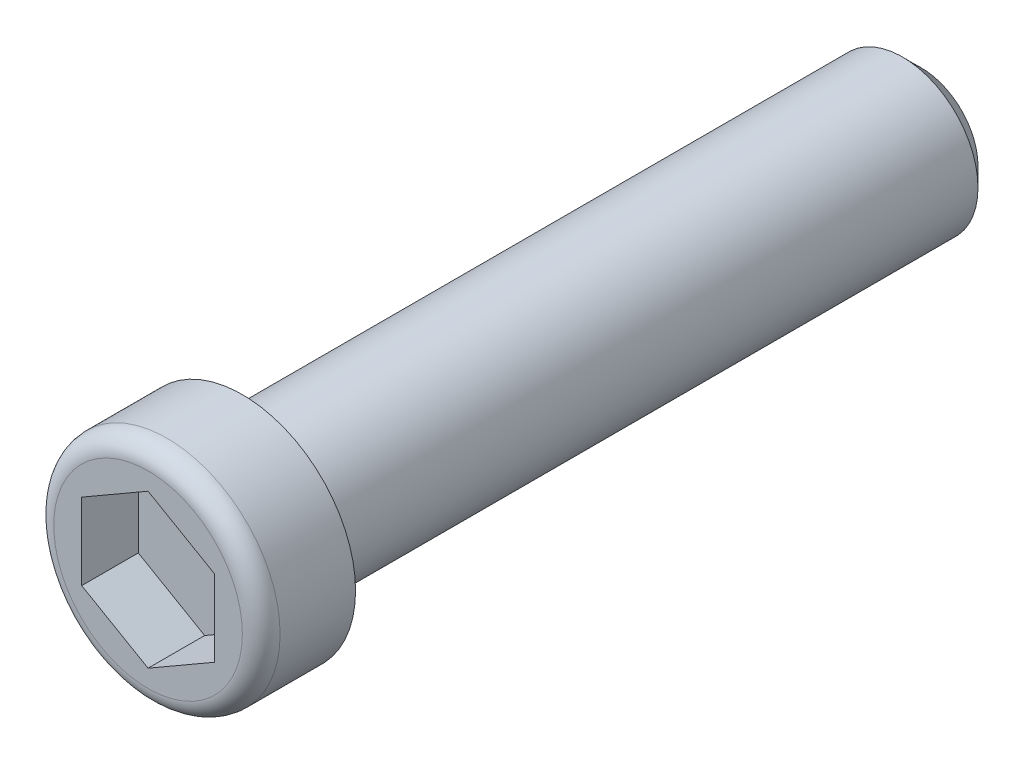
ISO-10303-21;
HEADER;
FILE_DESCRIPTION(('STEP AP214'),'2;1');
FILE_NAME('part.step','',(''),(''),'','','');
FILE_SCHEMA(('AUTOMOTIVE_DESIGN { 1 0 10303 214 1 1 1 1 }'));
ENDSEC;
DATA;
#1=APPLICATION_CONTEXT('core data for automotive mechanical design processes');
#2=APPLICATION_PROTOCOL_DEFINITION('international standard','automotive_design',2000,#1);
#3=PRODUCT_CONTEXT('',#1,'mechanical');
#4=PRODUCT('Part','Part','',(#3));
#5=PRODUCT_RELATED_PRODUCT_CATEGORY('part','',(#4));
#6=PRODUCT_DEFINITION_FORMATION('','',#4);
#7=PRODUCT_DEFINITION_CONTEXT('part definition',#1,'design');
#8=PRODUCT_DEFINITION('design','',#6,#7);
#9=PRODUCT_DEFINITION_SHAPE('','',#8);
#10=(LENGTH_UNIT() NAMED_UNIT(*) SI_UNIT(.MILLI.,.METRE.));
#11=(NAMED_UNIT(*) PLANE_ANGLE_UNIT() SI_UNIT($,.RADIAN.));
#12=(NAMED_UNIT(*) SI_UNIT($,.STERADIAN.) SOLID_ANGLE_UNIT());
#13=UNCERTAINTY_MEASURE_WITH_UNIT(LENGTH_MEASURE(1.E-05),#10,'distance_accuracy_value','');
#14=(GEOMETRIC_REPRESENTATION_CONTEXT(3) GLOBAL_UNCERTAINTY_ASSIGNED_CONTEXT((#13)) GLOBAL_UNIT_ASSIGNED_CONTEXT((#10,
#11,#12)) REPRESENTATION_CONTEXT('',''));
#15=CARTESIAN_POINT('',(0.,0.,0.));
#16=DIRECTION('',(0.,0.,1.));
#17=DIRECTION('',(1.,0.,0.));
#18=AXIS2_PLACEMENT_3D('',#15,#16,#17);
#19=CARTESIAN_POINT('',(0.,0.,18.));
#20=DIRECTION('',(0.,0.,-1.));
#21=DIRECTION('',(-1.,0.,0.));
#22=AXIS2_PLACEMENT_3D('',#19,#20,#21);
#23=CYLINDRICAL_SURFACE('',#22,2.);
#24=CARTESIAN_POINT('',(0.,0.,0.5));
#25=DIRECTION('',(0.,0.,1.));
#26=DIRECTION('',(1.,0.,0.));
#27=AXIS2_PLACEMENT_3D('',#24,#25,#26);
#28=CIRCLE('',#27,2.);
#29=CARTESIAN_POINT('',(2.,0.,0.5));
#30=VERTEX_POINT('',#29);
#31=EDGE_CURVE('E152',#30,#30,#28,.T.);
#32=ORIENTED_EDGE('',*,*,#31,.T.);
#33=EDGE_LOOP('',(#32));
#34=FACE_BOUND('',#33,.T.);
#35=CARTESIAN_POINT('',(0.,0.,18.));
#36=DIRECTION('',(0.,0.,1.));
#37=DIRECTION('',(1.,0.,0.));
#38=AXIS2_PLACEMENT_3D('',#35,#36,#37);
#39=CIRCLE('',#38,2.);
#40=CARTESIAN_POINT('',(2.,0.,18.));
#41=VERTEX_POINT('',#40);
#42=EDGE_CURVE('E149',#41,#41,#39,.T.);
#43=ORIENTED_EDGE('',*,*,#42,.F.);
#44=EDGE_LOOP('',(#43));
#45=FACE_BOUND('',#44,.T.);
#46=ADVANCED_FACE('F39',(#34,#45),#23,.T.);
#47=CARTESIAN_POINT('',(0.,0.,0.));
#48=DIRECTION('',(0.,0.,1.));
#49=DIRECTION('',(1.,0.,0.));
#50=AXIS2_PLACEMENT_3D('',#47,#48,#49);
#51=PLANE('',#50);
#52=CARTESIAN_POINT('',(0.,0.,0.));
#53=DIRECTION('',(0.,0.,1.));
#54=DIRECTION('',(1.,0.,0.));
#55=AXIS2_PLACEMENT_3D('',#52,#53,#54);
#56=CIRCLE('',#55,1.49999999999999);
#57=CARTESIAN_POINT('',(1.49999999999999,0.,0.));
#58=VERTEX_POINT('',#57);
#59=EDGE_CURVE('E155',#58,#58,#56,.F.);
#60=ORIENTED_EDGE('',*,*,#59,.T.);
#61=EDGE_LOOP('',(#60));
#62=FACE_BOUND('',#61,.T.);
#63=ADVANCED_FACE('F172',(#62),#51,.F.);
#64=CARTESIAN_POINT('',(0.,0.,20.5));
#65=DIRECTION('',(0.,0.,-1.));
#66=DIRECTION('',(-1.,0.,0.));
#67=AXIS2_PLACEMENT_3D('',#64,#65,#66);
#68=CYLINDRICAL_SURFACE('',#67,3.);
#69=CARTESIAN_POINT('',(0.,0.,20.));
#70=DIRECTION('',(0.,0.,1.));
#71=DIRECTION('',(1.,0.,0.));
#72=AXIS2_PLACEMENT_3D('',#69,#70,#71);
#73=CIRCLE('',#72,3.);
#74=CARTESIAN_POINT('',(3.,0.,20.));
#75=VERTEX_POINT('',#74);
#76=EDGE_CURVE('E11',#75,#75,#73,.F.);
#77=ORIENTED_EDGE('',*,*,#76,.T.);
#78=EDGE_LOOP('',(#77));
#79=FACE_BOUND('',#78,.T.);
#80=CARTESIAN_POINT('',(0.,0.,18.));
#81=DIRECTION('',(0.,0.,1.));
#82=DIRECTION('',(1.,0.,0.));
#83=AXIS2_PLACEMENT_3D('',#80,#81,#82);
#84=CIRCLE('',#83,3.);
#85=CARTESIAN_POINT('',(3.,0.,18.));
#86=VERTEX_POINT('',#85);
#87=EDGE_CURVE('E141',#86,#86,#84,.T.);
#88=ORIENTED_EDGE('',*,*,#87,.T.);
#89=EDGE_LOOP('',(#88));
#90=FACE_BOUND('',#89,.T.);
#91=ADVANCED_FACE('F178',(#79,#90),#68,.T.);
#92=CARTESIAN_POINT('',(0.,0.,20.5));
#93=DIRECTION('',(0.,0.,1.));
#94=DIRECTION('',(1.,0.,0.));
#95=AXIS2_PLACEMENT_3D('',#92,#93,#94);
#96=PLANE('',#95);
#97=CARTESIAN_POINT('',(0.,0.,20.5));
#98=DIRECTION('',(0.,0.,1.));
#99=DIRECTION('',(1.,0.,0.));
#100=AXIS2_PLACEMENT_3D('',#97,#98,#99);
#101=CIRCLE('',#100,2.5);
#102=CARTESIAN_POINT('',(2.5,0.,20.5));
#103=VERTEX_POINT('',#102);
#104=EDGE_CURVE('E47',#103,#103,#101,.T.);
#105=ORIENTED_EDGE('',*,*,#104,.T.);
#106=EDGE_LOOP('',(#105));
#107=FACE_BOUND('',#106,.T.);
#108=DIRECTION('',(-0.866025403784441,0.499999999999995,0.));
#109=VECTOR('',#108,1.);
#110=CARTESIAN_POINT('',(1.75946033133062,1.01582489592223,20.5));
#111=LINE('',#110,#109);
#112=CARTESIAN_POINT('',(1.75946033133062,1.01582489592223,20.5));
#113=VERTEX_POINT('',#112);
#114=CARTESIAN_POINT('',(0.,2.03164979184442,20.5));
#115=VERTEX_POINT('',#114);
#116=EDGE_CURVE('E54',#113,#115,#111,.T.);
#117=ORIENTED_EDGE('',*,*,#116,.F.);
#118=DIRECTION('',(0.,1.,0.));
#119=VECTOR('',#118,1.);
#120=CARTESIAN_POINT('',(1.75946033133064,-1.01582489592219,20.5));
#121=LINE('',#120,#119);
#122=CARTESIAN_POINT('',(1.75946033133064,-1.01582489592219,20.5));
#123=VERTEX_POINT('',#122);
#124=EDGE_CURVE('E137',#123,#113,#121,.T.);
#125=ORIENTED_EDGE('',*,*,#124,.F.);
#126=DIRECTION('',(0.866025403784434,0.500000000000007,0.));
#127=VECTOR('',#126,1.);
#128=CARTESIAN_POINT('',(0.,-2.03164979184442,20.5));
#129=LINE('',#128,#127);
#130=CARTESIAN_POINT('',(0.,-2.03164979184442,20.5));
#131=VERTEX_POINT('',#130);
#132=EDGE_CURVE('E135',#131,#123,#129,.T.);
#133=ORIENTED_EDGE('',*,*,#132,.F.);
#134=DIRECTION('',(0.866025403784442,-0.499999999999995,0.));
#135=VECTOR('',#134,1.);
#136=CARTESIAN_POINT('',(-1.75946033133063,-1.01582489592222,20.5));
#137=LINE('',#136,#135);
#138=CARTESIAN_POINT('',(-1.75946033133063,-1.01582489592222,20.5));
#139=VERTEX_POINT('',#138);
#140=EDGE_CURVE('E102',#139,#131,#137,.T.);
#141=ORIENTED_EDGE('',*,*,#140,.F.);
#142=DIRECTION('',(0.,-1.,0.));
#143=VECTOR('',#142,1.);
#144=CARTESIAN_POINT('',(-1.75946033133064,1.01582489592221,20.5));
#145=LINE('',#144,#143);
#146=CARTESIAN_POINT('',(-1.75946033133064,1.01582489592221,20.5));
#147=VERTEX_POINT('',#146);
#148=EDGE_CURVE('E131',#147,#139,#145,.T.);
#149=ORIENTED_EDGE('',*,*,#148,.F.);
#150=DIRECTION('',(-0.866025403784438,-0.500000000000001,0.));
#151=VECTOR('',#150,1.);
#152=CARTESIAN_POINT('',(0.,2.03164979184442,20.5));
#153=LINE('',#152,#151);
#154=EDGE_CURVE('E128',#115,#147,#153,.T.);
#155=ORIENTED_EDGE('',*,*,#154,.F.);
#156=EDGE_LOOP('',(#117,#125,#133,#141,#149,#155));
#157=FACE_BOUND('',#156,.T.);
#158=ADVANCED_FACE('F160',(#107,#157),#96,.T.);
#159=CARTESIAN_POINT('',(0.,0.,18.));
#160=DIRECTION('',(0.,0.,1.));
#161=DIRECTION('',(1.,0.,0.));
#162=AXIS2_PLACEMENT_3D('',#159,#160,#161);
#163=PLANE('',#162);
#164=ORIENTED_EDGE('',*,*,#42,.T.);
#165=EDGE_LOOP('',(#164));
#166=FACE_BOUND('',#165,.T.);
#167=ORIENTED_EDGE('',*,*,#87,.F.);
#168=EDGE_LOOP('',(#167));
#169=FACE_BOUND('',#168,.T.);
#170=ADVANCED_FACE('F186',(#166,#169),#163,.F.);
#171=CARTESIAN_POINT('',(1.75946033133062,1.01582489592223,19.));
#172=DIRECTION('',(0.499999999999995,0.866025403784442,0.));
#173=DIRECTION('',(-0.866025403784442,0.499999999999995,0.));
#174=AXIS2_PLACEMENT_3D('',#171,#172,#173);
#175=PLANE('',#174);
#176=ORIENTED_EDGE('',*,*,#116,.T.);
#177=DIRECTION('',(0.,0.,1.));
#178=VECTOR('',#177,1.);
#179=CARTESIAN_POINT('',(0.,2.03164979184442,19.));
#180=LINE('',#179,#178);
#181=CARTESIAN_POINT('',(0.,2.03164979184442,19.));
#182=VERTEX_POINT('',#181);
#183=EDGE_CURVE('E84',#182,#115,#180,.T.);
#184=ORIENTED_EDGE('',*,*,#183,.F.);
#185=DIRECTION('',(-0.866025403784441,0.499999999999995,0.));
#186=VECTOR('',#185,1.);
#187=CARTESIAN_POINT('',(1.75946033133062,1.01582489592223,19.));
#188=LINE('',#187,#186);
#189=CARTESIAN_POINT('',(1.75946033133062,1.01582489592223,19.));
#190=VERTEX_POINT('',#189);
#191=EDGE_CURVE('E139',#190,#182,#188,.T.);
#192=ORIENTED_EDGE('',*,*,#191,.F.);
#193=DIRECTION('',(0.,0.,1.));
#194=VECTOR('',#193,1.);
#195=CARTESIAN_POINT('',(1.75946033133062,1.01582489592223,19.));
#196=LINE('',#195,#194);
#197=EDGE_CURVE('E62',#190,#113,#196,.T.);
#198=ORIENTED_EDGE('',*,*,#197,.T.);
#199=EDGE_LOOP('',(#176,#184,#192,#198));
#200=FACE_BOUND('',#199,.T.);
#201=ADVANCED_FACE('F189',(#200),#175,.F.);
#202=CARTESIAN_POINT('',(1.75946033133064,-1.01582489592219,19.));
#203=DIRECTION('',(1.,0.,0.));
#204=DIRECTION('',(0.,1.,0.));
#205=AXIS2_PLACEMENT_3D('',#202,#203,#204);
#206=PLANE('',#205);
#207=ORIENTED_EDGE('',*,*,#124,.T.);
#208=ORIENTED_EDGE('',*,*,#197,.F.);
#209=DIRECTION('',(0.,1.,0.));
#210=VECTOR('',#209,1.);
#211=CARTESIAN_POINT('',(1.75946033133064,-1.01582489592219,19.));
#212=LINE('',#211,#210);
#213=CARTESIAN_POINT('',(1.75946033133064,-1.01582489592219,19.));
#214=VERTEX_POINT('',#213);
#215=EDGE_CURVE('E114',#214,#190,#212,.T.);
#216=ORIENTED_EDGE('',*,*,#215,.F.);
#217=DIRECTION('',(0.,0.,1.));
#218=VECTOR('',#217,1.);
#219=CARTESIAN_POINT('',(1.75946033133064,-1.01582489592219,19.));
#220=LINE('',#219,#218);
#221=EDGE_CURVE('E106',#214,#123,#220,.T.);
#222=ORIENTED_EDGE('',*,*,#221,.T.);
#223=EDGE_LOOP('',(#207,#208,#216,#222));
#224=FACE_BOUND('',#223,.T.);
#225=ADVANCED_FACE('F195',(#224),#206,.F.);
#226=CARTESIAN_POINT('',(0.,-2.03164979184442,19.));
#227=DIRECTION('',(0.500000000000007,-0.866025403784435,0.));
#228=DIRECTION('',(0.866025403784434,0.500000000000007,0.));
#229=AXIS2_PLACEMENT_3D('',#226,#227,#228);
#230=PLANE('',#229);
#231=ORIENTED_EDGE('',*,*,#132,.T.);
#232=ORIENTED_EDGE('',*,*,#221,.F.);
#233=DIRECTION('',(0.866025403784434,0.500000000000007,0.));
#234=VECTOR('',#233,1.);
#235=CARTESIAN_POINT('',(0.,-2.03164979184442,19.));
#236=LINE('',#235,#234);
#237=CARTESIAN_POINT('',(0.,-2.03164979184442,19.));
#238=VERTEX_POINT('',#237);
#239=EDGE_CURVE('E110',#238,#214,#236,.T.);
#240=ORIENTED_EDGE('',*,*,#239,.F.);
#241=DIRECTION('',(0.,0.,1.));
#242=VECTOR('',#241,1.);
#243=CARTESIAN_POINT('',(0.,-2.03164979184442,19.));
#244=LINE('',#243,#242);
#245=EDGE_CURVE('E95',#238,#131,#244,.T.);
#246=ORIENTED_EDGE('',*,*,#245,.T.);
#247=EDGE_LOOP('',(#231,#232,#240,#246));
#248=FACE_BOUND('',#247,.T.);
#249=ADVANCED_FACE('F111',(#248),#230,.F.);
#250=CARTESIAN_POINT('',(-1.75946033133063,-1.01582489592222,19.));
#251=DIRECTION('',(-0.499999999999995,-0.866025403784441,0.));
#252=DIRECTION('',(0.866025403784442,-0.499999999999995,0.));
#253=AXIS2_PLACEMENT_3D('',#250,#251,#252);
#254=PLANE('',#253);
#255=ORIENTED_EDGE('',*,*,#140,.T.);
#256=ORIENTED_EDGE('',*,*,#245,.F.);
#257=DIRECTION('',(0.866025403784442,-0.499999999999995,0.));
#258=VECTOR('',#257,1.);
#259=CARTESIAN_POINT('',(-1.75946033133063,-1.01582489592222,19.));
#260=LINE('',#259,#258);
#261=CARTESIAN_POINT('',(-1.75946033133063,-1.01582489592222,19.));
#262=VERTEX_POINT('',#261);
#263=EDGE_CURVE('E99',#262,#238,#260,.T.);
#264=ORIENTED_EDGE('',*,*,#263,.F.);
#265=DIRECTION('',(0.,0.,1.));
#266=VECTOR('',#265,1.);
#267=CARTESIAN_POINT('',(-1.75946033133063,-1.01582489592222,19.));
#268=LINE('',#267,#266);
#269=EDGE_CURVE('E107',#262,#139,#268,.T.);
#270=ORIENTED_EDGE('',*,*,#269,.T.);
#271=EDGE_LOOP('',(#255,#256,#264,#270));
#272=FACE_BOUND('',#271,.T.);
#273=ADVANCED_FACE('F97',(#272),#254,.F.);
#274=CARTESIAN_POINT('',(-1.75946033133064,1.01582489592221,19.));
#275=DIRECTION('',(-1.,0.,0.));
#276=DIRECTION('',(0.,-1.,0.));
#277=AXIS2_PLACEMENT_3D('',#274,#275,#276);
#278=PLANE('',#277);
#279=ORIENTED_EDGE('',*,*,#148,.T.);
#280=ORIENTED_EDGE('',*,*,#269,.F.);
#281=DIRECTION('',(0.,-1.,0.));
#282=VECTOR('',#281,1.);
#283=CARTESIAN_POINT('',(-1.75946033133064,1.01582489592221,19.));
#284=LINE('',#283,#282);
#285=CARTESIAN_POINT('',(-1.75946033133064,1.01582489592221,19.));
#286=VERTEX_POINT('',#285);
#287=EDGE_CURVE('E120',#286,#262,#284,.T.);
#288=ORIENTED_EDGE('',*,*,#287,.F.);
#289=DIRECTION('',(0.,0.,1.));
#290=VECTOR('',#289,1.);
#291=CARTESIAN_POINT('',(-1.75946033133064,1.01582489592221,19.));
#292=LINE('',#291,#290);
#293=EDGE_CURVE('E144',#286,#147,#292,.T.);
#294=ORIENTED_EDGE('',*,*,#293,.T.);
#295=EDGE_LOOP('',(#279,#280,#288,#294));
#296=FACE_BOUND('',#295,.T.);
#297=ADVANCED_FACE('F199',(#296),#278,.F.);
#298=CARTESIAN_POINT('',(0.,2.03164979184442,19.));
#299=DIRECTION('',(-0.500000000000001,0.866025403784438,0.));
#300=DIRECTION('',(-0.866025403784438,-0.500000000000001,0.));
#301=AXIS2_PLACEMENT_3D('',#298,#299,#300);
#302=PLANE('',#301);
#303=ORIENTED_EDGE('',*,*,#154,.T.);
#304=ORIENTED_EDGE('',*,*,#293,.F.);
#305=DIRECTION('',(-0.866025403784438,-0.500000000000001,0.));
#306=VECTOR('',#305,1.);
#307=CARTESIAN_POINT('',(0.,2.03164979184442,19.));
#308=LINE('',#307,#306);
#309=EDGE_CURVE('E122',#182,#286,#308,.T.);
#310=ORIENTED_EDGE('',*,*,#309,.F.);
#311=ORIENTED_EDGE('',*,*,#183,.T.);
#312=EDGE_LOOP('',(#303,#304,#310,#311));
#313=FACE_BOUND('',#312,.T.);
#314=ADVANCED_FACE('F196',(#313),#302,.F.);
#315=CARTESIAN_POINT('',(0.,0.,19.));
#316=DIRECTION('',(0.,0.,1.));
#317=DIRECTION('',(1.,0.,0.));
#318=AXIS2_PLACEMENT_3D('',#315,#316,#317);
#319=PLANE('',#318);
#320=ORIENTED_EDGE('',*,*,#191,.T.);
#321=ORIENTED_EDGE('',*,*,#309,.T.);
#322=ORIENTED_EDGE('',*,*,#287,.T.);
#323=ORIENTED_EDGE('',*,*,#263,.T.);
#324=ORIENTED_EDGE('',*,*,#239,.T.);
#325=ORIENTED_EDGE('',*,*,#215,.T.);
#326=EDGE_LOOP('',(#320,#321,#322,#323,#324,#325));
#327=FACE_BOUND('',#326,.T.);
#328=ADVANCED_FACE('F117',(#327),#319,.T.);
#329=CARTESIAN_POINT('',(0.,0.,0.5));
#330=DIRECTION('',(0.,0.,1.));
#331=DIRECTION('',(1.,0.,0.));
#332=AXIS2_PLACEMENT_3D('',#329,#330,#331);
#333=CONICAL_SURFACE('',#332,2.,0.785398163397452);
#334=ORIENTED_EDGE('',*,*,#59,.F.);
#335=EDGE_LOOP('',(#334));
#336=FACE_BOUND('',#335,.T.);
#337=ORIENTED_EDGE('',*,*,#31,.F.);
#338=EDGE_LOOP('',(#337));
#339=FACE_BOUND('',#338,.T.);
#340=ADVANCED_FACE('F164',(#336,#339),#333,.T.);
#341=CARTESIAN_POINT('',(0.,0.,20.));
#342=DIRECTION('',(0.,0.,1.));
#343=DIRECTION('',(1.,0.,0.));
#344=AXIS2_PLACEMENT_3D('',#341,#342,#343);
#345=TOROIDAL_SURFACE('',#344,2.5,0.5);
#346=ORIENTED_EDGE('',*,*,#76,.F.);
#347=EDGE_LOOP('',(#346));
#348=FACE_BOUND('',#347,.T.);
#349=ORIENTED_EDGE('',*,*,#104,.F.);
#350=EDGE_LOOP('',(#349));
#351=FACE_BOUND('',#350,.T.);
#352=ADVANCED_FACE('F41',(#348,#351),#345,.T.);
#353=CLOSED_SHELL('',(#46,#63,#91,#158,#170,#201,#225,#249,#273,#297,#314,#328,#340,#352));
#354=MANIFOLD_SOLID_BREP('B2',#353);
#355=ADVANCED_BREP_SHAPE_REPRESENTATION('',(#18,#354),#14);
#356=SHAPE_DEFINITION_REPRESENTATION(#9,#355);
ENDSEC;
END-ISO-10303-21;
